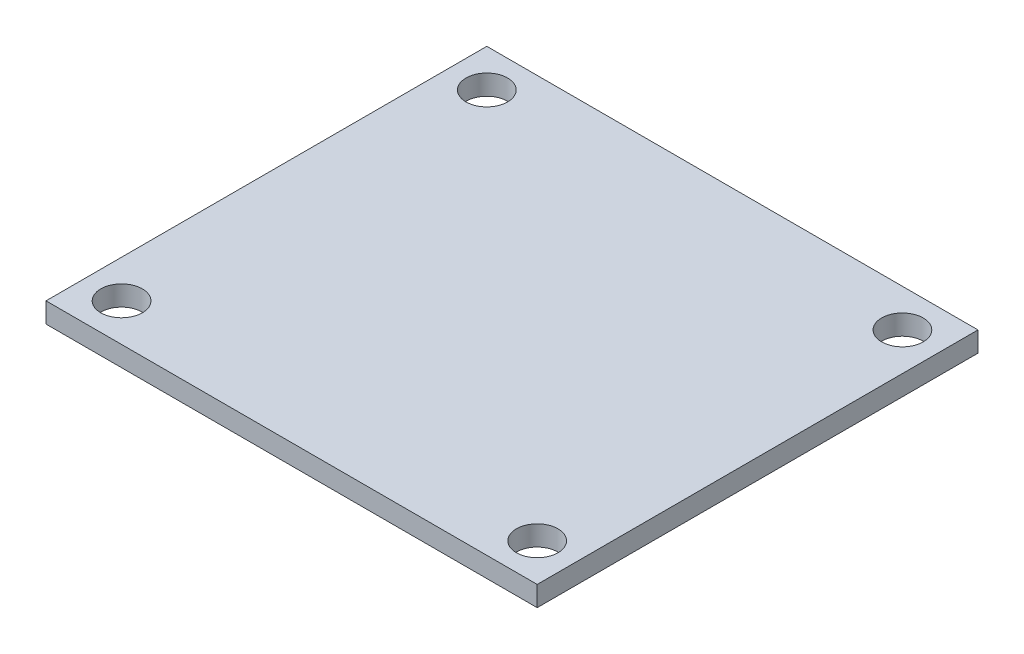
ISO-10303-21;
HEADER;
FILE_DESCRIPTION(('STEP AP214'),'2;1');
FILE_NAME('part.step','',(''),(''),'','','');
FILE_SCHEMA(('AUTOMOTIVE_DESIGN { 1 0 10303 214 1 1 1 1 }'));
ENDSEC;
DATA;
#1=APPLICATION_CONTEXT('core data for automotive mechanical design processes');
#2=APPLICATION_PROTOCOL_DEFINITION('international standard','automotive_design',2000,#1);
#3=PRODUCT_CONTEXT('',#1,'mechanical');
#4=PRODUCT('Part','Part','',(#3));
#5=PRODUCT_RELATED_PRODUCT_CATEGORY('part','',(#4));
#6=PRODUCT_DEFINITION_FORMATION('','',#4);
#7=PRODUCT_DEFINITION_CONTEXT('part definition',#1,'design');
#8=PRODUCT_DEFINITION('design','',#6,#7);
#9=PRODUCT_DEFINITION_SHAPE('','',#8);
#10=(LENGTH_UNIT() NAMED_UNIT(*) SI_UNIT(.MILLI.,.METRE.));
#11=(NAMED_UNIT(*) PLANE_ANGLE_UNIT() SI_UNIT($,.RADIAN.));
#12=(NAMED_UNIT(*) SI_UNIT($,.STERADIAN.) SOLID_ANGLE_UNIT());
#13=UNCERTAINTY_MEASURE_WITH_UNIT(LENGTH_MEASURE(1.E-05),#10,'distance_accuracy_value','');
#14=(GEOMETRIC_REPRESENTATION_CONTEXT(3) GLOBAL_UNCERTAINTY_ASSIGNED_CONTEXT((#13)) GLOBAL_UNIT_ASSIGNED_CONTEXT((#10,
#11,#12)) REPRESENTATION_CONTEXT('',''));
#15=CARTESIAN_POINT('',(0.,0.,0.));
#16=DIRECTION('',(0.,0.,1.));
#17=DIRECTION('',(1.,0.,0.));
#18=AXIS2_PLACEMENT_3D('',#15,#16,#17);
#19=CARTESIAN_POINT('',(0.,1.6,0.));
#20=DIRECTION('',(0.,1.,0.));
#21=DIRECTION('',(0.,0.,1.));
#22=AXIS2_PLACEMENT_3D('',#19,#20,#21);
#23=PLANE('',#22);
#24=CARTESIAN_POINT('',(-16.5,1.6,-14.5));
#25=DIRECTION('',(0.,1.,0.));
#26=DIRECTION('',(0.,0.,1.));
#27=AXIS2_PLACEMENT_3D('',#24,#25,#26);
#28=CIRCLE('',#27,1.65);
#29=CARTESIAN_POINT('',(-16.5,1.6,-12.85));
#30=VERTEX_POINT('',#29);
#31=EDGE_CURVE('E150',#30,#30,#28,.T.);
#32=ORIENTED_EDGE('',*,*,#31,.F.);
#33=EDGE_LOOP('',(#32));
#34=FACE_BOUND('',#33,.T.);
#35=CARTESIAN_POINT('',(16.5,1.6,14.5));
#36=DIRECTION('',(0.,1.,0.));
#37=DIRECTION('',(0.,0.,1.));
#38=AXIS2_PLACEMENT_3D('',#35,#36,#37);
#39=CIRCLE('',#38,1.64999999999999);
#40=CARTESIAN_POINT('',(16.5,1.6,16.15));
#41=VERTEX_POINT('',#40);
#42=EDGE_CURVE('E120',#41,#41,#39,.T.);
#43=ORIENTED_EDGE('',*,*,#42,.F.);
#44=EDGE_LOOP('',(#43));
#45=FACE_BOUND('',#44,.T.);
#46=DIRECTION('',(0.,0.,1.));
#47=VECTOR('',#46,1.);
#48=CARTESIAN_POINT('',(-19.5,1.6,17.5));
#49=LINE('',#48,#47);
#50=CARTESIAN_POINT('',(-19.5,1.6,-17.5));
#51=VERTEX_POINT('',#50);
#52=CARTESIAN_POINT('',(-19.5,1.6,17.5));
#53=VERTEX_POINT('',#52);
#54=EDGE_CURVE('E98',#51,#53,#49,.T.);
#55=ORIENTED_EDGE('',*,*,#54,.T.);
#56=DIRECTION('',(1.,0.,0.));
#57=VECTOR('',#56,1.);
#58=CARTESIAN_POINT('',(19.5,1.6,17.5));
#59=LINE('',#58,#57);
#60=CARTESIAN_POINT('',(19.5,1.6,17.5));
#61=VERTEX_POINT('',#60);
#62=EDGE_CURVE('E93',#53,#61,#59,.T.);
#63=ORIENTED_EDGE('',*,*,#62,.T.);
#64=DIRECTION('',(0.,0.,-1.));
#65=VECTOR('',#64,1.);
#66=CARTESIAN_POINT('',(19.5,1.6,17.5));
#67=LINE('',#66,#65);
#68=CARTESIAN_POINT('',(19.5,1.6,-17.5));
#69=VERTEX_POINT('',#68);
#70=EDGE_CURVE('E96',#61,#69,#67,.T.);
#71=ORIENTED_EDGE('',*,*,#70,.T.);
#72=DIRECTION('',(-1.,0.,0.));
#73=VECTOR('',#72,1.);
#74=CARTESIAN_POINT('',(19.5,1.6,-17.5));
#75=LINE('',#74,#73);
#76=EDGE_CURVE('E63',#69,#51,#75,.T.);
#77=ORIENTED_EDGE('',*,*,#76,.T.);
#78=EDGE_LOOP('',(#55,#63,#71,#77));
#79=FACE_BOUND('',#78,.T.);
#80=CARTESIAN_POINT('',(-16.5,1.6,14.5));
#81=DIRECTION('',(0.,1.,0.));
#82=DIRECTION('',(0.,0.,1.));
#83=AXIS2_PLACEMENT_3D('',#80,#81,#82);
#84=CIRCLE('',#83,1.64999999999999);
#85=CARTESIAN_POINT('',(-16.5,1.6,16.15));
#86=VERTEX_POINT('',#85);
#87=EDGE_CURVE('E142',#86,#86,#84,.T.);
#88=ORIENTED_EDGE('',*,*,#87,.F.);
#89=EDGE_LOOP('',(#88));
#90=FACE_BOUND('',#89,.T.);
#91=CARTESIAN_POINT('',(16.5,1.6,-14.5));
#92=DIRECTION('',(0.,1.,0.));
#93=DIRECTION('',(0.,0.,1.));
#94=AXIS2_PLACEMENT_3D('',#91,#92,#93);
#95=CIRCLE('',#94,1.64999999999999);
#96=CARTESIAN_POINT('',(16.5,1.6,-12.85));
#97=VERTEX_POINT('',#96);
#98=EDGE_CURVE('E157',#97,#97,#95,.T.);
#99=ORIENTED_EDGE('',*,*,#98,.F.);
#100=EDGE_LOOP('',(#99));
#101=FACE_BOUND('',#100,.T.);
#102=ADVANCED_FACE('F45',(#34,#45,#79,#90,#101),#23,.T.);
#103=CARTESIAN_POINT('',(0.,0.,0.));
#104=DIRECTION('',(0.,1.,0.));
#105=DIRECTION('',(0.,0.,1.));
#106=AXIS2_PLACEMENT_3D('',#103,#104,#105);
#107=PLANE('',#106);
#108=DIRECTION('',(0.,0.,1.));
#109=VECTOR('',#108,1.);
#110=CARTESIAN_POINT('',(-19.5,0.,17.5));
#111=LINE('',#110,#109);
#112=CARTESIAN_POINT('',(-19.5,0.,-17.5));
#113=VERTEX_POINT('',#112);
#114=CARTESIAN_POINT('',(-19.5,0.,17.5));
#115=VERTEX_POINT('',#114);
#116=EDGE_CURVE('E116',#113,#115,#111,.T.);
#117=ORIENTED_EDGE('',*,*,#116,.F.);
#118=DIRECTION('',(-1.,0.,0.));
#119=VECTOR('',#118,1.);
#120=CARTESIAN_POINT('',(19.5,0.,-17.5));
#121=LINE('',#120,#119);
#122=CARTESIAN_POINT('',(19.5,0.,-17.5));
#123=VERTEX_POINT('',#122);
#124=EDGE_CURVE('E86',#123,#113,#121,.T.);
#125=ORIENTED_EDGE('',*,*,#124,.F.);
#126=DIRECTION('',(0.,0.,-1.));
#127=VECTOR('',#126,1.);
#128=CARTESIAN_POINT('',(19.5,0.,17.5));
#129=LINE('',#128,#127);
#130=CARTESIAN_POINT('',(19.5,0.,17.5));
#131=VERTEX_POINT('',#130);
#132=EDGE_CURVE('E80',#131,#123,#129,.T.);
#133=ORIENTED_EDGE('',*,*,#132,.F.);
#134=DIRECTION('',(1.,0.,0.));
#135=VECTOR('',#134,1.);
#136=CARTESIAN_POINT('',(19.5,0.,17.5));
#137=LINE('',#136,#135);
#138=EDGE_CURVE('E103',#115,#131,#137,.T.);
#139=ORIENTED_EDGE('',*,*,#138,.F.);
#140=EDGE_LOOP('',(#117,#125,#133,#139));
#141=FACE_BOUND('',#140,.T.);
#142=CARTESIAN_POINT('',(16.5,0.,14.5));
#143=DIRECTION('',(0.,1.,0.));
#144=DIRECTION('',(0.,0.,1.));
#145=AXIS2_PLACEMENT_3D('',#142,#143,#144);
#146=CIRCLE('',#145,1.64999999999999);
#147=CARTESIAN_POINT('',(16.5,0.,16.15));
#148=VERTEX_POINT('',#147);
#149=EDGE_CURVE('E139',#148,#148,#146,.T.);
#150=ORIENTED_EDGE('',*,*,#149,.T.);
#151=EDGE_LOOP('',(#150));
#152=FACE_BOUND('',#151,.T.);
#153=CARTESIAN_POINT('',(-16.5,0.,14.5));
#154=DIRECTION('',(0.,1.,0.));
#155=DIRECTION('',(0.,0.,1.));
#156=AXIS2_PLACEMENT_3D('',#153,#154,#155);
#157=CIRCLE('',#156,1.64999999999999);
#158=CARTESIAN_POINT('',(-16.5,0.,16.15));
#159=VERTEX_POINT('',#158);
#160=EDGE_CURVE('E146',#159,#159,#157,.T.);
#161=ORIENTED_EDGE('',*,*,#160,.T.);
#162=EDGE_LOOP('',(#161));
#163=FACE_BOUND('',#162,.T.);
#164=CARTESIAN_POINT('',(-16.5,0.,-14.5));
#165=DIRECTION('',(0.,1.,0.));
#166=DIRECTION('',(0.,0.,1.));
#167=AXIS2_PLACEMENT_3D('',#164,#165,#166);
#168=CIRCLE('',#167,1.65);
#169=CARTESIAN_POINT('',(-16.5,0.,-12.85));
#170=VERTEX_POINT('',#169);
#171=EDGE_CURVE('E154',#170,#170,#168,.T.);
#172=ORIENTED_EDGE('',*,*,#171,.T.);
#173=EDGE_LOOP('',(#172));
#174=FACE_BOUND('',#173,.T.);
#175=CARTESIAN_POINT('',(16.5,0.,-14.5));
#176=DIRECTION('',(0.,1.,0.));
#177=DIRECTION('',(0.,0.,1.));
#178=AXIS2_PLACEMENT_3D('',#175,#176,#177);
#179=CIRCLE('',#178,1.64999999999999);
#180=CARTESIAN_POINT('',(16.5,0.,-12.85));
#181=VERTEX_POINT('',#180);
#182=EDGE_CURVE('E161',#181,#181,#179,.T.);
#183=ORIENTED_EDGE('',*,*,#182,.T.);
#184=EDGE_LOOP('',(#183));
#185=FACE_BOUND('',#184,.T.);
#186=ADVANCED_FACE('F134',(#141,#152,#163,#174,#185),#107,.F.);
#187=CARTESIAN_POINT('',(-19.5,1.6,17.5));
#188=DIRECTION('',(1.,0.,0.));
#189=DIRECTION('',(0.,0.,-1.));
#190=AXIS2_PLACEMENT_3D('',#187,#188,#189);
#191=PLANE('',#190);
#192=ORIENTED_EDGE('',*,*,#116,.T.);
#193=DIRECTION('',(0.,-1.,0.));
#194=VECTOR('',#193,1.);
#195=CARTESIAN_POINT('',(-19.5,1.6,17.5));
#196=LINE('',#195,#194);
#197=EDGE_CURVE('E11',#53,#115,#196,.T.);
#198=ORIENTED_EDGE('',*,*,#197,.F.);
#199=ORIENTED_EDGE('',*,*,#54,.F.);
#200=DIRECTION('',(0.,-1.,0.));
#201=VECTOR('',#200,1.);
#202=CARTESIAN_POINT('',(-19.5,1.6,-17.5));
#203=LINE('',#202,#201);
#204=EDGE_CURVE('E112',#51,#113,#203,.T.);
#205=ORIENTED_EDGE('',*,*,#204,.T.);
#206=EDGE_LOOP('',(#192,#198,#199,#205));
#207=FACE_BOUND('',#206,.T.);
#208=ADVANCED_FACE('F47',(#207),#191,.F.);
#209=CARTESIAN_POINT('',(19.5,1.6,17.5));
#210=DIRECTION('',(0.,0.,-1.));
#211=DIRECTION('',(-1.,0.,0.));
#212=AXIS2_PLACEMENT_3D('',#209,#210,#211);
#213=PLANE('',#212);
#214=ORIENTED_EDGE('',*,*,#138,.T.);
#215=DIRECTION('',(0.,-1.,0.));
#216=VECTOR('',#215,1.);
#217=CARTESIAN_POINT('',(19.5,1.6,17.5));
#218=LINE('',#217,#216);
#219=EDGE_CURVE('E55',#61,#131,#218,.T.);
#220=ORIENTED_EDGE('',*,*,#219,.F.);
#221=ORIENTED_EDGE('',*,*,#62,.F.);
#222=ORIENTED_EDGE('',*,*,#197,.T.);
#223=EDGE_LOOP('',(#214,#220,#221,#222));
#224=FACE_BOUND('',#223,.T.);
#225=ADVANCED_FACE('F102',(#224),#213,.F.);
#226=CARTESIAN_POINT('',(19.5,1.6,17.5));
#227=DIRECTION('',(-1.,0.,0.));
#228=DIRECTION('',(0.,0.,1.));
#229=AXIS2_PLACEMENT_3D('',#226,#227,#228);
#230=PLANE('',#229);
#231=ORIENTED_EDGE('',*,*,#132,.T.);
#232=DIRECTION('',(0.,-1.,0.));
#233=VECTOR('',#232,1.);
#234=CARTESIAN_POINT('',(19.5,1.6,-17.5));
#235=LINE('',#234,#233);
#236=EDGE_CURVE('E105',#69,#123,#235,.T.);
#237=ORIENTED_EDGE('',*,*,#236,.F.);
#238=ORIENTED_EDGE('',*,*,#70,.F.);
#239=ORIENTED_EDGE('',*,*,#219,.T.);
#240=EDGE_LOOP('',(#231,#237,#238,#239));
#241=FACE_BOUND('',#240,.T.);
#242=ADVANCED_FACE('F106',(#241),#230,.F.);
#243=CARTESIAN_POINT('',(19.5,1.6,-17.5));
#244=DIRECTION('',(0.,0.,1.));
#245=DIRECTION('',(1.,0.,0.));
#246=AXIS2_PLACEMENT_3D('',#243,#244,#245);
#247=PLANE('',#246);
#248=ORIENTED_EDGE('',*,*,#124,.T.);
#249=ORIENTED_EDGE('',*,*,#204,.F.);
#250=ORIENTED_EDGE('',*,*,#76,.F.);
#251=ORIENTED_EDGE('',*,*,#236,.T.);
#252=EDGE_LOOP('',(#248,#249,#250,#251));
#253=FACE_BOUND('',#252,.T.);
#254=ADVANCED_FACE('F131',(#253),#247,.F.);
#255=CARTESIAN_POINT('',(16.5,1.6,14.5));
#256=DIRECTION('',(0.,-1.,0.));
#257=DIRECTION('',(0.,0.,-1.));
#258=AXIS2_PLACEMENT_3D('',#255,#256,#257);
#259=CYLINDRICAL_SURFACE('',#258,1.64999999999999);
#260=ORIENTED_EDGE('',*,*,#42,.T.);
#261=EDGE_LOOP('',(#260));
#262=FACE_BOUND('',#261,.T.);
#263=ORIENTED_EDGE('',*,*,#149,.F.);
#264=EDGE_LOOP('',(#263));
#265=FACE_BOUND('',#264,.T.);
#266=ADVANCED_FACE('F180',(#262,#265),#259,.F.);
#267=CARTESIAN_POINT('',(-16.5,1.6,14.5));
#268=DIRECTION('',(0.,-1.,0.));
#269=DIRECTION('',(0.,0.,-1.));
#270=AXIS2_PLACEMENT_3D('',#267,#268,#269);
#271=CYLINDRICAL_SURFACE('',#270,1.64999999999999);
#272=ORIENTED_EDGE('',*,*,#87,.T.);
#273=EDGE_LOOP('',(#272));
#274=FACE_BOUND('',#273,.T.);
#275=ORIENTED_EDGE('',*,*,#160,.F.);
#276=EDGE_LOOP('',(#275));
#277=FACE_BOUND('',#276,.T.);
#278=ADVANCED_FACE('F231',(#274,#277),#271,.F.);
#279=CARTESIAN_POINT('',(-16.5,1.6,-14.5));
#280=DIRECTION('',(0.,-1.,0.));
#281=DIRECTION('',(0.,0.,-1.));
#282=AXIS2_PLACEMENT_3D('',#279,#280,#281);
#283=CYLINDRICAL_SURFACE('',#282,1.65);
#284=ORIENTED_EDGE('',*,*,#31,.T.);
#285=EDGE_LOOP('',(#284));
#286=FACE_BOUND('',#285,.T.);
#287=ORIENTED_EDGE('',*,*,#171,.F.);
#288=EDGE_LOOP('',(#287));
#289=FACE_BOUND('',#288,.T.);
#290=ADVANCED_FACE('F240',(#286,#289),#283,.F.);
#291=CARTESIAN_POINT('',(16.5,1.6,-14.5));
#292=DIRECTION('',(0.,-1.,0.));
#293=DIRECTION('',(0.,0.,-1.));
#294=AXIS2_PLACEMENT_3D('',#291,#292,#293);
#295=CYLINDRICAL_SURFACE('',#294,1.64999999999999);
#296=ORIENTED_EDGE('',*,*,#98,.T.);
#297=EDGE_LOOP('',(#296));
#298=FACE_BOUND('',#297,.T.);
#299=ORIENTED_EDGE('',*,*,#182,.F.);
#300=EDGE_LOOP('',(#299));
#301=FACE_BOUND('',#300,.T.);
#302=ADVANCED_FACE('F168',(#298,#301),#295,.F.);
#303=CLOSED_SHELL('',(#102,#186,#208,#225,#242,#254,#266,#278,#290,#302));
#304=MANIFOLD_SOLID_BREP('B2',#303);
#305=ADVANCED_BREP_SHAPE_REPRESENTATION('',(#18,#304),#14);
#306=SHAPE_DEFINITION_REPRESENTATION(#9,#305);
ENDSEC;
END-ISO-10303-21;
